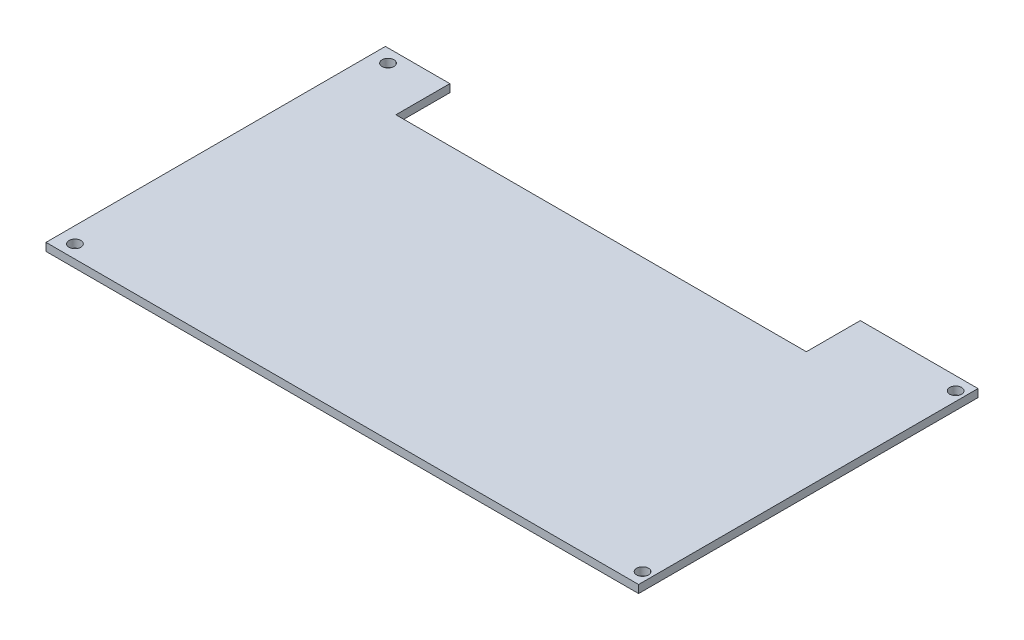
ISO-10303-21;
HEADER;
FILE_DESCRIPTION(('STEP AP214'),'2;1');
FILE_NAME('part.step','',(''),(''),'','','');
FILE_SCHEMA(('AUTOMOTIVE_DESIGN { 1 0 10303 214 1 1 1 1 }'));
ENDSEC;
DATA;
#1=APPLICATION_CONTEXT('core data for automotive mechanical design processes');
#2=APPLICATION_PROTOCOL_DEFINITION('international standard','automotive_design',2000,#1);
#3=PRODUCT_CONTEXT('',#1,'mechanical');
#4=PRODUCT('Part','Part','',(#3));
#5=PRODUCT_RELATED_PRODUCT_CATEGORY('part','',(#4));
#6=PRODUCT_DEFINITION_FORMATION('','',#4);
#7=PRODUCT_DEFINITION_CONTEXT('part definition',#1,'design');
#8=PRODUCT_DEFINITION('design','',#6,#7);
#9=PRODUCT_DEFINITION_SHAPE('','',#8);
#10=(LENGTH_UNIT() NAMED_UNIT(*) SI_UNIT(.MILLI.,.METRE.));
#11=(NAMED_UNIT(*) PLANE_ANGLE_UNIT() SI_UNIT($,.RADIAN.));
#12=(NAMED_UNIT(*) SI_UNIT($,.STERADIAN.) SOLID_ANGLE_UNIT());
#13=UNCERTAINTY_MEASURE_WITH_UNIT(LENGTH_MEASURE(1.E-05),#10,'distance_accuracy_value','');
#14=(GEOMETRIC_REPRESENTATION_CONTEXT(3) GLOBAL_UNCERTAINTY_ASSIGNED_CONTEXT((#13)) GLOBAL_UNIT_ASSIGNED_CONTEXT((#10,
#11,#12)) REPRESENTATION_CONTEXT('',''));
#15=CARTESIAN_POINT('',(0.,0.,0.));
#16=DIRECTION('',(0.,0.,1.));
#17=DIRECTION('',(1.,0.,0.));
#18=AXIS2_PLACEMENT_3D('',#15,#16,#17);
#19=CARTESIAN_POINT('',(-88.12,3.,-129.));
#20=DIRECTION('',(0.,0.,1.));
#21=DIRECTION('',(1.,0.,0.));
#22=AXIS2_PLACEMENT_3D('',#19,#20,#21);
#23=PLANE('',#22);
#24=DIRECTION('',(-1.,0.,0.));
#25=VECTOR('',#24,1.);
#26=CARTESIAN_POINT('',(-88.12,0.,-129.));
#27=LINE('',#26,#25);
#28=CARTESIAN_POINT('',(-88.12,0.,-129.));
#29=VERTEX_POINT('',#28);
#30=CARTESIAN_POINT('',(-112.62,0.,-129.));
#31=VERTEX_POINT('',#30);
#32=EDGE_CURVE('E135',#29,#31,#27,.T.);
#33=ORIENTED_EDGE('',*,*,#32,.T.);
#34=DIRECTION('',(0.,-1.,0.));
#35=VECTOR('',#34,1.);
#36=CARTESIAN_POINT('',(-112.62,3.,-129.));
#37=LINE('',#36,#35);
#38=CARTESIAN_POINT('',(-112.62,3.,-129.));
#39=VERTEX_POINT('',#38);
#40=EDGE_CURVE('E11',#39,#31,#37,.T.);
#41=ORIENTED_EDGE('',*,*,#40,.F.);
#42=DIRECTION('',(-1.,0.,0.));
#43=VECTOR('',#42,1.);
#44=CARTESIAN_POINT('',(-88.12,3.,-129.));
#45=LINE('',#44,#43);
#46=CARTESIAN_POINT('',(-88.12,3.,-129.));
#47=VERTEX_POINT('',#46);
#48=EDGE_CURVE('E150',#47,#39,#45,.T.);
#49=ORIENTED_EDGE('',*,*,#48,.F.);
#50=DIRECTION('',(0.,-1.,0.));
#51=VECTOR('',#50,1.);
#52=CARTESIAN_POINT('',(-88.12,3.,-129.));
#53=LINE('',#52,#51);
#54=EDGE_CURVE('E131',#47,#29,#53,.T.);
#55=ORIENTED_EDGE('',*,*,#54,.T.);
#56=EDGE_LOOP('',(#33,#41,#49,#55));
#57=FACE_BOUND('',#56,.T.);
#58=ADVANCED_FACE('F37',(#57),#23,.F.);
#59=CARTESIAN_POINT('',(-112.62,3.,-129.));
#60=DIRECTION('',(1.,0.,0.));
#61=DIRECTION('',(0.,0.,-1.));
#62=AXIS2_PLACEMENT_3D('',#59,#60,#61);
#63=PLANE('',#62);
#64=DIRECTION('',(0.,0.,1.));
#65=VECTOR('',#64,1.);
#66=CARTESIAN_POINT('',(-112.62,0.,-129.));
#67=LINE('',#66,#65);
#68=CARTESIAN_POINT('',(-112.62,0.,0.));
#69=VERTEX_POINT('',#68);
#70=EDGE_CURVE('E138',#31,#69,#67,.T.);
#71=ORIENTED_EDGE('',*,*,#70,.T.);
#72=DIRECTION('',(0.,-1.,0.));
#73=VECTOR('',#72,1.);
#74=CARTESIAN_POINT('',(-112.62,3.,0.));
#75=LINE('',#74,#73);
#76=CARTESIAN_POINT('',(-112.62,3.,0.));
#77=VERTEX_POINT('',#76);
#78=EDGE_CURVE('E46',#77,#69,#75,.T.);
#79=ORIENTED_EDGE('',*,*,#78,.F.);
#80=DIRECTION('',(0.,0.,1.));
#81=VECTOR('',#80,1.);
#82=CARTESIAN_POINT('',(-112.62,3.,-129.));
#83=LINE('',#82,#81);
#84=EDGE_CURVE('E98',#39,#77,#83,.T.);
#85=ORIENTED_EDGE('',*,*,#84,.F.);
#86=ORIENTED_EDGE('',*,*,#40,.T.);
#87=EDGE_LOOP('',(#71,#79,#85,#86));
#88=FACE_BOUND('',#87,.T.);
#89=ADVANCED_FACE('F219',(#88),#63,.F.);
#90=CARTESIAN_POINT('',(-112.62,3.,0.));
#91=DIRECTION('',(0.,0.,-1.));
#92=DIRECTION('',(-1.,0.,0.));
#93=AXIS2_PLACEMENT_3D('',#90,#91,#92);
#94=PLANE('',#93);
#95=DIRECTION('',(1.,0.,0.));
#96=VECTOR('',#95,1.);
#97=CARTESIAN_POINT('',(-112.62,0.,0.));
#98=LINE('',#97,#96);
#99=CARTESIAN_POINT('',(112.62,0.,0.));
#100=VERTEX_POINT('',#99);
#101=EDGE_CURVE('E141',#69,#100,#98,.T.);
#102=ORIENTED_EDGE('',*,*,#101,.T.);
#103=DIRECTION('',(0.,-1.,0.));
#104=VECTOR('',#103,1.);
#105=CARTESIAN_POINT('',(112.62,3.,0.));
#106=LINE('',#105,#104);
#107=CARTESIAN_POINT('',(112.62,3.,0.));
#108=VERTEX_POINT('',#107);
#109=EDGE_CURVE('E157',#108,#100,#106,.T.);
#110=ORIENTED_EDGE('',*,*,#109,.F.);
#111=DIRECTION('',(1.,0.,0.));
#112=VECTOR('',#111,1.);
#113=CARTESIAN_POINT('',(-112.62,3.,0.));
#114=LINE('',#113,#112);
#115=EDGE_CURVE('E187',#77,#108,#114,.T.);
#116=ORIENTED_EDGE('',*,*,#115,.F.);
#117=ORIENTED_EDGE('',*,*,#78,.T.);
#118=EDGE_LOOP('',(#102,#110,#116,#117));
#119=FACE_BOUND('',#118,.T.);
#120=ADVANCED_FACE('F223',(#119),#94,.F.);
#121=CARTESIAN_POINT('',(112.62,3.,0.));
#122=DIRECTION('',(-1.,0.,0.));
#123=DIRECTION('',(0.,0.,1.));
#124=AXIS2_PLACEMENT_3D('',#121,#122,#123);
#125=PLANE('',#124);
#126=DIRECTION('',(0.,0.,-1.));
#127=VECTOR('',#126,1.);
#128=CARTESIAN_POINT('',(112.62,0.,0.));
#129=LINE('',#128,#127);
#130=CARTESIAN_POINT('',(112.62,0.,-129.));
#131=VERTEX_POINT('',#130);
#132=EDGE_CURVE('E143',#100,#131,#129,.T.);
#133=ORIENTED_EDGE('',*,*,#132,.T.);
#134=DIRECTION('',(0.,-1.,0.));
#135=VECTOR('',#134,1.);
#136=CARTESIAN_POINT('',(112.62,3.,-129.));
#137=LINE('',#136,#135);
#138=CARTESIAN_POINT('',(112.62,3.,-129.));
#139=VERTEX_POINT('',#138);
#140=EDGE_CURVE('E154',#139,#131,#137,.T.);
#141=ORIENTED_EDGE('',*,*,#140,.F.);
#142=DIRECTION('',(0.,0.,-1.));
#143=VECTOR('',#142,1.);
#144=CARTESIAN_POINT('',(112.62,3.,0.));
#145=LINE('',#144,#143);
#146=EDGE_CURVE('E189',#108,#139,#145,.T.);
#147=ORIENTED_EDGE('',*,*,#146,.F.);
#148=ORIENTED_EDGE('',*,*,#109,.T.);
#149=EDGE_LOOP('',(#133,#141,#147,#148));
#150=FACE_BOUND('',#149,.T.);
#151=ADVANCED_FACE('F195',(#150),#125,.F.);
#152=CARTESIAN_POINT('',(112.62,3.,-129.));
#153=DIRECTION('',(0.,0.,1.));
#154=DIRECTION('',(1.,0.,0.));
#155=AXIS2_PLACEMENT_3D('',#152,#153,#154);
#156=PLANE('',#155);
#157=DIRECTION('',(-1.,0.,0.));
#158=VECTOR('',#157,1.);
#159=CARTESIAN_POINT('',(112.62,0.,-129.));
#160=LINE('',#159,#158);
#161=CARTESIAN_POINT('',(67.88,0.,-129.));
#162=VERTEX_POINT('',#161);
#163=EDGE_CURVE('E145',#131,#162,#160,.T.);
#164=ORIENTED_EDGE('',*,*,#163,.T.);
#165=DIRECTION('',(0.,-1.,0.));
#166=VECTOR('',#165,1.);
#167=CARTESIAN_POINT('',(67.88,3.,-129.));
#168=LINE('',#167,#166);
#169=CARTESIAN_POINT('',(67.88,3.,-129.));
#170=VERTEX_POINT('',#169);
#171=EDGE_CURVE('E126',#170,#162,#168,.T.);
#172=ORIENTED_EDGE('',*,*,#171,.F.);
#173=DIRECTION('',(-1.,0.,0.));
#174=VECTOR('',#173,1.);
#175=CARTESIAN_POINT('',(112.62,3.,-129.));
#176=LINE('',#175,#174);
#177=EDGE_CURVE('E117',#139,#170,#176,.T.);
#178=ORIENTED_EDGE('',*,*,#177,.F.);
#179=ORIENTED_EDGE('',*,*,#140,.T.);
#180=EDGE_LOOP('',(#164,#172,#178,#179));
#181=FACE_BOUND('',#180,.T.);
#182=ADVANCED_FACE('F199',(#181),#156,.F.);
#183=CARTESIAN_POINT('',(67.88,3.,-129.));
#184=DIRECTION('',(1.,0.,0.));
#185=DIRECTION('',(0.,0.,-1.));
#186=AXIS2_PLACEMENT_3D('',#183,#184,#185);
#187=PLANE('',#186);
#188=DIRECTION('',(0.,0.,1.));
#189=VECTOR('',#188,1.);
#190=CARTESIAN_POINT('',(67.88,0.,-129.));
#191=LINE('',#190,#189);
#192=CARTESIAN_POINT('',(67.88,0.,-108.5));
#193=VERTEX_POINT('',#192);
#194=EDGE_CURVE('E125',#162,#193,#191,.T.);
#195=ORIENTED_EDGE('',*,*,#194,.T.);
#196=DIRECTION('',(0.,-1.,0.));
#197=VECTOR('',#196,1.);
#198=CARTESIAN_POINT('',(67.88,3.,-108.5));
#199=LINE('',#198,#197);
#200=CARTESIAN_POINT('',(67.88,3.,-108.5));
#201=VERTEX_POINT('',#200);
#202=EDGE_CURVE('E122',#201,#193,#199,.T.);
#203=ORIENTED_EDGE('',*,*,#202,.F.);
#204=DIRECTION('',(0.,0.,1.));
#205=VECTOR('',#204,1.);
#206=CARTESIAN_POINT('',(67.88,3.,-129.));
#207=LINE('',#206,#205);
#208=EDGE_CURVE('E111',#170,#201,#207,.T.);
#209=ORIENTED_EDGE('',*,*,#208,.F.);
#210=ORIENTED_EDGE('',*,*,#171,.T.);
#211=EDGE_LOOP('',(#195,#203,#209,#210));
#212=FACE_BOUND('',#211,.T.);
#213=ADVANCED_FACE('F123',(#212),#187,.F.);
#214=CARTESIAN_POINT('',(67.88,3.,-108.5));
#215=DIRECTION('',(0.,0.,1.));
#216=DIRECTION('',(1.,0.,0.));
#217=AXIS2_PLACEMENT_3D('',#214,#215,#216);
#218=PLANE('',#217);
#219=DIRECTION('',(-1.,0.,0.));
#220=VECTOR('',#219,1.);
#221=CARTESIAN_POINT('',(67.88,0.,-108.5));
#222=LINE('',#221,#220);
#223=CARTESIAN_POINT('',(-88.12,0.,-108.5));
#224=VERTEX_POINT('',#223);
#225=EDGE_CURVE('E84',#193,#224,#222,.T.);
#226=ORIENTED_EDGE('',*,*,#225,.T.);
#227=DIRECTION('',(0.,-1.,0.));
#228=VECTOR('',#227,1.);
#229=CARTESIAN_POINT('',(-88.12,3.,-108.5));
#230=LINE('',#229,#228);
#231=CARTESIAN_POINT('',(-88.12,3.,-108.5));
#232=VERTEX_POINT('',#231);
#233=EDGE_CURVE('E127',#232,#224,#230,.T.);
#234=ORIENTED_EDGE('',*,*,#233,.F.);
#235=DIRECTION('',(-1.,0.,0.));
#236=VECTOR('',#235,1.);
#237=CARTESIAN_POINT('',(67.88,3.,-108.5));
#238=LINE('',#237,#236);
#239=EDGE_CURVE('E115',#201,#232,#238,.T.);
#240=ORIENTED_EDGE('',*,*,#239,.F.);
#241=ORIENTED_EDGE('',*,*,#202,.T.);
#242=EDGE_LOOP('',(#226,#234,#240,#241));
#243=FACE_BOUND('',#242,.T.);
#244=ADVANCED_FACE('F129',(#243),#218,.F.);
#245=CARTESIAN_POINT('',(-88.12,3.,-108.5));
#246=DIRECTION('',(-1.,0.,0.));
#247=DIRECTION('',(0.,0.,1.));
#248=AXIS2_PLACEMENT_3D('',#245,#246,#247);
#249=PLANE('',#248);
#250=DIRECTION('',(0.,0.,-1.));
#251=VECTOR('',#250,1.);
#252=CARTESIAN_POINT('',(-88.12,0.,-108.5));
#253=LINE('',#252,#251);
#254=EDGE_CURVE('E90',#224,#29,#253,.T.);
#255=ORIENTED_EDGE('',*,*,#254,.T.);
#256=ORIENTED_EDGE('',*,*,#54,.F.);
#257=DIRECTION('',(0.,0.,-1.));
#258=VECTOR('',#257,1.);
#259=CARTESIAN_POINT('',(-88.12,3.,-108.5));
#260=LINE('',#259,#258);
#261=EDGE_CURVE('E55',#232,#47,#260,.T.);
#262=ORIENTED_EDGE('',*,*,#261,.F.);
#263=ORIENTED_EDGE('',*,*,#233,.T.);
#264=EDGE_LOOP('',(#255,#256,#262,#263));
#265=FACE_BOUND('',#264,.T.);
#266=ADVANCED_FACE('F207',(#265),#249,.F.);
#267=CARTESIAN_POINT('',(0.,3.,0.));
#268=DIRECTION('',(0.,1.,0.));
#269=DIRECTION('',(0.,0.,1.));
#270=AXIS2_PLACEMENT_3D('',#267,#268,#269);
#271=PLANE('',#270);
#272=CARTESIAN_POINT('',(-106.62,3.,-4.99999999999999));
#273=DIRECTION('',(0.,1.,0.));
#274=DIRECTION('',(0.,0.,1.));
#275=AXIS2_PLACEMENT_3D('',#272,#273,#274);
#276=CIRCLE('',#275,2.25);
#277=CARTESIAN_POINT('',(-106.62,3.,-2.74999999999999));
#278=VERTEX_POINT('',#277);
#279=EDGE_CURVE('E178',#278,#278,#276,.T.);
#280=ORIENTED_EDGE('',*,*,#279,.F.);
#281=EDGE_LOOP('',(#280));
#282=FACE_BOUND('',#281,.T.);
#283=CARTESIAN_POINT('',(-106.62,3.,-124.));
#284=DIRECTION('',(0.,1.,0.));
#285=DIRECTION('',(0.,0.,1.));
#286=AXIS2_PLACEMENT_3D('',#283,#284,#285);
#287=CIRCLE('',#286,2.25);
#288=CARTESIAN_POINT('',(-106.62,3.,-121.75));
#289=VERTEX_POINT('',#288);
#290=EDGE_CURVE('E168',#289,#289,#287,.T.);
#291=ORIENTED_EDGE('',*,*,#290,.F.);
#292=EDGE_LOOP('',(#291));
#293=FACE_BOUND('',#292,.T.);
#294=CARTESIAN_POINT('',(109.12,3.,-124.));
#295=DIRECTION('',(0.,1.,0.));
#296=DIRECTION('',(0.,0.,1.));
#297=AXIS2_PLACEMENT_3D('',#294,#295,#296);
#298=CIRCLE('',#297,2.25);
#299=CARTESIAN_POINT('',(109.12,3.,-121.75));
#300=VERTEX_POINT('',#299);
#301=EDGE_CURVE('E165',#300,#300,#298,.T.);
#302=ORIENTED_EDGE('',*,*,#301,.F.);
#303=EDGE_LOOP('',(#302));
#304=FACE_BOUND('',#303,.T.);
#305=CARTESIAN_POINT('',(109.12,3.,-5.00000000000003));
#306=DIRECTION('',(0.,1.,0.));
#307=DIRECTION('',(0.,0.,1.));
#308=AXIS2_PLACEMENT_3D('',#305,#306,#307);
#309=CIRCLE('',#308,2.25);
#310=CARTESIAN_POINT('',(109.12,3.,-2.75000000000003));
#311=VERTEX_POINT('',#310);
#312=EDGE_CURVE('E164',#311,#311,#309,.T.);
#313=ORIENTED_EDGE('',*,*,#312,.F.);
#314=EDGE_LOOP('',(#313));
#315=FACE_BOUND('',#314,.T.);
#316=ORIENTED_EDGE('',*,*,#48,.T.);
#317=ORIENTED_EDGE('',*,*,#84,.T.);
#318=ORIENTED_EDGE('',*,*,#115,.T.);
#319=ORIENTED_EDGE('',*,*,#146,.T.);
#320=ORIENTED_EDGE('',*,*,#177,.T.);
#321=ORIENTED_EDGE('',*,*,#208,.T.);
#322=ORIENTED_EDGE('',*,*,#239,.T.);
#323=ORIENTED_EDGE('',*,*,#261,.T.);
#324=EDGE_LOOP('',(#316,#317,#318,#319,#320,#321,#322,#323));
#325=FACE_BOUND('',#324,.T.);
#326=ADVANCED_FACE('F113',(#282,#293,#304,#315,#325),#271,.T.);
#327=CARTESIAN_POINT('',(0.,0.,0.));
#328=DIRECTION('',(0.,1.,0.));
#329=DIRECTION('',(0.,0.,1.));
#330=AXIS2_PLACEMENT_3D('',#327,#328,#329);
#331=PLANE('',#330);
#332=CARTESIAN_POINT('',(-106.62,0.,-4.99999999999999));
#333=DIRECTION('',(0.,1.,0.));
#334=DIRECTION('',(0.,0.,1.));
#335=AXIS2_PLACEMENT_3D('',#332,#333,#334);
#336=CIRCLE('',#335,2.25);
#337=CARTESIAN_POINT('',(-106.62,0.,-2.74999999999999));
#338=VERTEX_POINT('',#337);
#339=EDGE_CURVE('E40',#338,#338,#336,.T.);
#340=ORIENTED_EDGE('',*,*,#339,.T.);
#341=EDGE_LOOP('',(#340));
#342=FACE_BOUND('',#341,.T.);
#343=CARTESIAN_POINT('',(-106.62,0.,-124.));
#344=DIRECTION('',(0.,1.,0.));
#345=DIRECTION('',(0.,0.,1.));
#346=AXIS2_PLACEMENT_3D('',#343,#344,#345);
#347=CIRCLE('',#346,2.25);
#348=CARTESIAN_POINT('',(-106.62,0.,-121.75));
#349=VERTEX_POINT('',#348);
#350=EDGE_CURVE('E166',#349,#349,#347,.T.);
#351=ORIENTED_EDGE('',*,*,#350,.T.);
#352=EDGE_LOOP('',(#351));
#353=FACE_BOUND('',#352,.T.);
#354=CARTESIAN_POINT('',(109.12,0.,-124.));
#355=DIRECTION('',(0.,1.,0.));
#356=DIRECTION('',(0.,0.,1.));
#357=AXIS2_PLACEMENT_3D('',#354,#355,#356);
#358=CIRCLE('',#357,2.25);
#359=CARTESIAN_POINT('',(109.12,0.,-121.75));
#360=VERTEX_POINT('',#359);
#361=EDGE_CURVE('E162',#360,#360,#358,.T.);
#362=ORIENTED_EDGE('',*,*,#361,.T.);
#363=EDGE_LOOP('',(#362));
#364=FACE_BOUND('',#363,.T.);
#365=CARTESIAN_POINT('',(109.12,0.,-5.00000000000003));
#366=DIRECTION('',(0.,1.,0.));
#367=DIRECTION('',(0.,0.,1.));
#368=AXIS2_PLACEMENT_3D('',#365,#366,#367);
#369=CIRCLE('',#368,2.25);
#370=CARTESIAN_POINT('',(109.12,0.,-2.75000000000003));
#371=VERTEX_POINT('',#370);
#372=EDGE_CURVE('E139',#371,#371,#369,.T.);
#373=ORIENTED_EDGE('',*,*,#372,.T.);
#374=EDGE_LOOP('',(#373));
#375=FACE_BOUND('',#374,.T.);
#376=ORIENTED_EDGE('',*,*,#32,.F.);
#377=ORIENTED_EDGE('',*,*,#254,.F.);
#378=ORIENTED_EDGE('',*,*,#225,.F.);
#379=ORIENTED_EDGE('',*,*,#194,.F.);
#380=ORIENTED_EDGE('',*,*,#163,.F.);
#381=ORIENTED_EDGE('',*,*,#132,.F.);
#382=ORIENTED_EDGE('',*,*,#101,.F.);
#383=ORIENTED_EDGE('',*,*,#70,.F.);
#384=EDGE_LOOP('',(#376,#377,#378,#379,#380,#381,#382,#383));
#385=FACE_BOUND('',#384,.T.);
#386=ADVANCED_FACE('F202',(#342,#353,#364,#375,#385),#331,.F.);
#387=CARTESIAN_POINT('',(109.12,3.,-5.00000000000003));
#388=DIRECTION('',(0.,1.,0.));
#389=DIRECTION('',(0.,0.,1.));
#390=AXIS2_PLACEMENT_3D('',#387,#388,#389);
#391=CYLINDRICAL_SURFACE('',#390,2.25);
#392=ORIENTED_EDGE('',*,*,#312,.T.);
#393=EDGE_LOOP('',(#392));
#394=FACE_BOUND('',#393,.T.);
#395=ORIENTED_EDGE('',*,*,#372,.F.);
#396=EDGE_LOOP('',(#395));
#397=FACE_BOUND('',#396,.T.);
#398=ADVANCED_FACE('F262',(#394,#397),#391,.F.);
#399=CARTESIAN_POINT('',(109.12,3.,-124.));
#400=DIRECTION('',(0.,1.,0.));
#401=DIRECTION('',(0.,0.,1.));
#402=AXIS2_PLACEMENT_3D('',#399,#400,#401);
#403=CYLINDRICAL_SURFACE('',#402,2.25);
#404=ORIENTED_EDGE('',*,*,#301,.T.);
#405=EDGE_LOOP('',(#404));
#406=FACE_BOUND('',#405,.T.);
#407=ORIENTED_EDGE('',*,*,#361,.F.);
#408=EDGE_LOOP('',(#407));
#409=FACE_BOUND('',#408,.T.);
#410=ADVANCED_FACE('F271',(#406,#409),#403,.F.);
#411=CARTESIAN_POINT('',(-106.62,3.,-124.));
#412=DIRECTION('',(0.,1.,0.));
#413=DIRECTION('',(0.,0.,1.));
#414=AXIS2_PLACEMENT_3D('',#411,#412,#413);
#415=CYLINDRICAL_SURFACE('',#414,2.25);
#416=ORIENTED_EDGE('',*,*,#290,.T.);
#417=EDGE_LOOP('',(#416));
#418=FACE_BOUND('',#417,.T.);
#419=ORIENTED_EDGE('',*,*,#350,.F.);
#420=EDGE_LOOP('',(#419));
#421=FACE_BOUND('',#420,.T.);
#422=ADVANCED_FACE('F281',(#418,#421),#415,.F.);
#423=CARTESIAN_POINT('',(-106.62,3.,-4.99999999999999));
#424=DIRECTION('',(0.,1.,0.));
#425=DIRECTION('',(0.,0.,1.));
#426=AXIS2_PLACEMENT_3D('',#423,#424,#425);
#427=CYLINDRICAL_SURFACE('',#426,2.25);
#428=ORIENTED_EDGE('',*,*,#279,.T.);
#429=EDGE_LOOP('',(#428));
#430=FACE_BOUND('',#429,.T.);
#431=ORIENTED_EDGE('',*,*,#339,.F.);
#432=EDGE_LOOP('',(#431));
#433=FACE_BOUND('',#432,.T.);
#434=ADVANCED_FACE('F291',(#430,#433),#427,.F.);
#435=CLOSED_SHELL('',(#58,#89,#120,#151,#182,#213,#244,#266,#326,#386,#398,#410,#422,#434));
#436=MANIFOLD_SOLID_BREP('B2',#435);
#437=ADVANCED_BREP_SHAPE_REPRESENTATION('',(#18,#436),#14);
#438=SHAPE_DEFINITION_REPRESENTATION(#9,#437);
ENDSEC;
END-ISO-10303-21;
